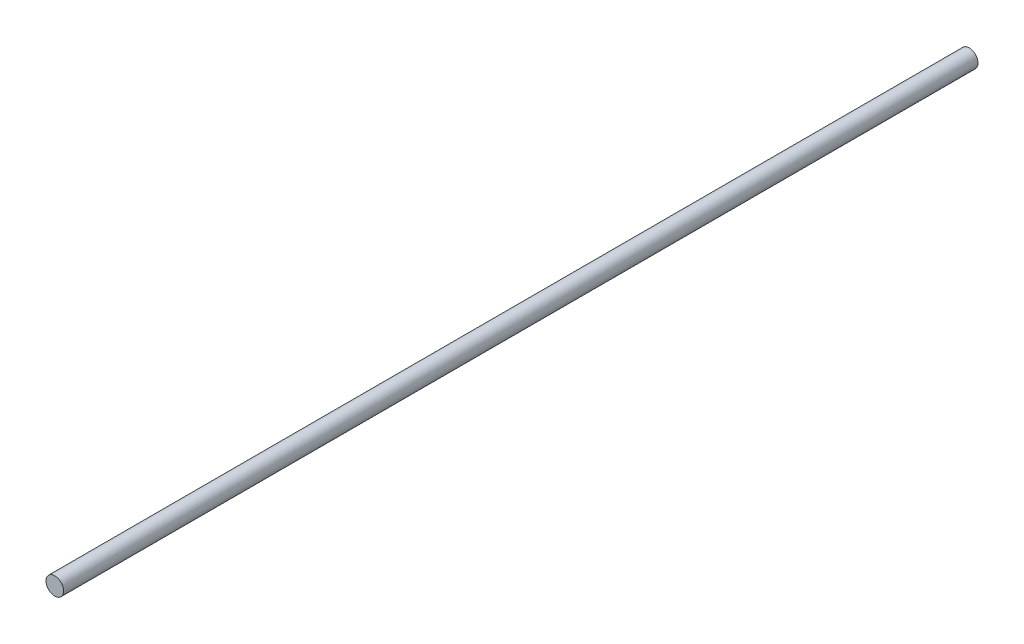
ISO-10303-21;
HEADER;
FILE_DESCRIPTION(('STEP AP214'),'2;1');
FILE_NAME('part.step','',(''),(''),'','','');
FILE_SCHEMA(('AUTOMOTIVE_DESIGN { 1 0 10303 214 1 1 1 1 }'));
ENDSEC;
DATA;
#1=APPLICATION_CONTEXT('core data for automotive mechanical design processes');
#2=APPLICATION_PROTOCOL_DEFINITION('international standard','automotive_design',2000,#1);
#3=PRODUCT_CONTEXT('',#1,'mechanical');
#4=PRODUCT('Part','Part','',(#3));
#5=PRODUCT_RELATED_PRODUCT_CATEGORY('part','',(#4));
#6=PRODUCT_DEFINITION_FORMATION('','',#4);
#7=PRODUCT_DEFINITION_CONTEXT('part definition',#1,'design');
#8=PRODUCT_DEFINITION('design','',#6,#7);
#9=PRODUCT_DEFINITION_SHAPE('','',#8);
#10=(LENGTH_UNIT() NAMED_UNIT(*) SI_UNIT(.MILLI.,.METRE.));
#11=(NAMED_UNIT(*) PLANE_ANGLE_UNIT() SI_UNIT($,.RADIAN.));
#12=(NAMED_UNIT(*) SI_UNIT($,.STERADIAN.) SOLID_ANGLE_UNIT());
#13=UNCERTAINTY_MEASURE_WITH_UNIT(LENGTH_MEASURE(1.E-05),#10,'distance_accuracy_value','');
#14=(GEOMETRIC_REPRESENTATION_CONTEXT(3) GLOBAL_UNCERTAINTY_ASSIGNED_CONTEXT((#13)) GLOBAL_UNIT_ASSIGNED_CONTEXT((#10,
#11,#12)) REPRESENTATION_CONTEXT('',''));
#15=CARTESIAN_POINT('',(0.,0.,0.));
#16=DIRECTION('',(0.,0.,1.));
#17=DIRECTION('',(1.,0.,0.));
#18=AXIS2_PLACEMENT_3D('',#15,#16,#17);
#19=CARTESIAN_POINT('',(0.,0.,415.));
#20=DIRECTION('',(0.,0.,-1.));
#21=DIRECTION('',(-1.,0.,0.));
#22=AXIS2_PLACEMENT_3D('',#19,#20,#21);
#23=CYLINDRICAL_SURFACE('',#22,4.);
#24=CARTESIAN_POINT('',(0.,0.,415.));
#25=DIRECTION('',(0.,0.,1.));
#26=DIRECTION('',(1.,0.,0.));
#27=AXIS2_PLACEMENT_3D('',#24,#25,#26);
#28=CIRCLE('',#27,4.);
#29=CARTESIAN_POINT('',(4.,0.,415.));
#30=VERTEX_POINT('',#29);
#31=EDGE_CURVE('E10',#30,#30,#28,.T.);
#32=ORIENTED_EDGE('',*,*,#31,.F.);
#33=EDGE_LOOP('',(#32));
#34=FACE_BOUND('',#33,.T.);
#35=CARTESIAN_POINT('',(0.,0.,0.));
#36=DIRECTION('',(0.,0.,1.));
#37=DIRECTION('',(1.,0.,0.));
#38=AXIS2_PLACEMENT_3D('',#35,#36,#37);
#39=CIRCLE('',#38,4.);
#40=CARTESIAN_POINT('',(4.,0.,0.));
#41=VERTEX_POINT('',#40);
#42=EDGE_CURVE('E34',#41,#41,#39,.T.);
#43=ORIENTED_EDGE('',*,*,#42,.T.);
#44=EDGE_LOOP('',(#43));
#45=FACE_BOUND('',#44,.T.);
#46=ADVANCED_FACE('F31',(#34,#45),#23,.T.);
#47=CARTESIAN_POINT('',(0.,0.,415.));
#48=DIRECTION('',(0.,0.,1.));
#49=DIRECTION('',(1.,0.,0.));
#50=AXIS2_PLACEMENT_3D('',#47,#48,#49);
#51=PLANE('',#50);
#52=ORIENTED_EDGE('',*,*,#31,.T.);
#53=EDGE_LOOP('',(#52));
#54=FACE_BOUND('',#53,.T.);
#55=ADVANCED_FACE('F46',(#54),#51,.T.);
#56=CARTESIAN_POINT('',(0.,0.,0.));
#57=DIRECTION('',(0.,0.,1.));
#58=DIRECTION('',(1.,0.,0.));
#59=AXIS2_PLACEMENT_3D('',#56,#57,#58);
#60=PLANE('',#59);
#61=ORIENTED_EDGE('',*,*,#42,.F.);
#62=EDGE_LOOP('',(#61));
#63=FACE_BOUND('',#62,.T.);
#64=ADVANCED_FACE('F44',(#63),#60,.F.);
#65=CLOSED_SHELL('',(#46,#55,#64));
#66=MANIFOLD_SOLID_BREP('B2',#65);
#67=ADVANCED_BREP_SHAPE_REPRESENTATION('',(#18,#66),#14);
#68=SHAPE_DEFINITION_REPRESENTATION(#9,#67);
ENDSEC;
END-ISO-10303-21;
